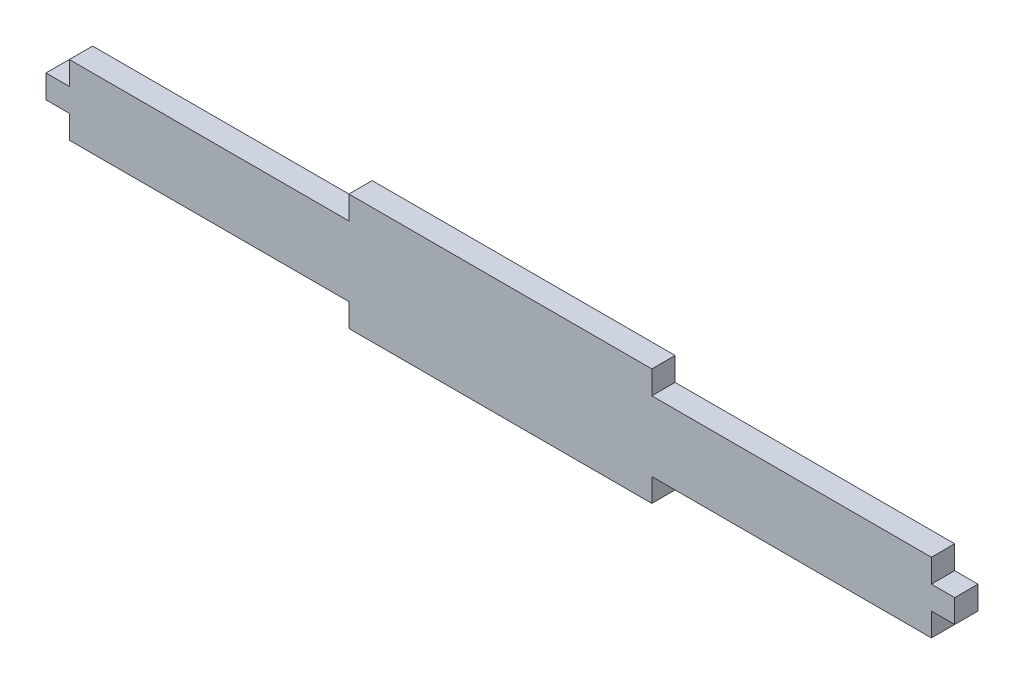
ISO-10303-21;
HEADER;
FILE_DESCRIPTION(('STEP AP214'),'2;1');
FILE_NAME('part.step','',(''),(''),'','','');
FILE_SCHEMA(('AUTOMOTIVE_DESIGN { 1 0 10303 214 1 1 1 1 }'));
ENDSEC;
DATA;
#1=APPLICATION_CONTEXT('core data for automotive mechanical design processes');
#2=APPLICATION_PROTOCOL_DEFINITION('international standard','automotive_design',2000,#1);
#3=PRODUCT_CONTEXT('',#1,'mechanical');
#4=PRODUCT('Part','Part','',(#3));
#5=PRODUCT_RELATED_PRODUCT_CATEGORY('part','',(#4));
#6=PRODUCT_DEFINITION_FORMATION('','',#4);
#7=PRODUCT_DEFINITION_CONTEXT('part definition',#1,'design');
#8=PRODUCT_DEFINITION('design','',#6,#7);
#9=PRODUCT_DEFINITION_SHAPE('','',#8);
#10=(LENGTH_UNIT() NAMED_UNIT(*) SI_UNIT(.MILLI.,.METRE.));
#11=(NAMED_UNIT(*) PLANE_ANGLE_UNIT() SI_UNIT($,.RADIAN.));
#12=(NAMED_UNIT(*) SI_UNIT($,.STERADIAN.) SOLID_ANGLE_UNIT());
#13=UNCERTAINTY_MEASURE_WITH_UNIT(LENGTH_MEASURE(1.E-05),#10,'distance_accuracy_value','');
#14=(GEOMETRIC_REPRESENTATION_CONTEXT(3) GLOBAL_UNCERTAINTY_ASSIGNED_CONTEXT((#13)) GLOBAL_UNIT_ASSIGNED_CONTEXT((#10,
#11,#12)) REPRESENTATION_CONTEXT('',''));
#15=CARTESIAN_POINT('',(0.,0.,0.));
#16=DIRECTION('',(0.,0.,1.));
#17=DIRECTION('',(1.,0.,0.));
#18=AXIS2_PLACEMENT_3D('',#15,#16,#17);
#19=CARTESIAN_POINT('',(-19.5,-7.5,3.));
#20=DIRECTION('',(1.,0.,0.));
#21=DIRECTION('',(0.,1.,0.));
#22=AXIS2_PLACEMENT_3D('',#19,#20,#21);
#23=PLANE('',#22);
#24=DIRECTION('',(0.,-1.,0.));
#25=VECTOR('',#24,1.);
#26=CARTESIAN_POINT('',(-19.5,-7.5,0.));
#27=LINE('',#26,#25);
#28=CARTESIAN_POINT('',(-19.5,-4.5,0.));
#29=VERTEX_POINT('',#28);
#30=CARTESIAN_POINT('',(-19.5,-7.5,0.));
#31=VERTEX_POINT('',#30);
#32=EDGE_CURVE('E201',#29,#31,#27,.T.);
#33=ORIENTED_EDGE('',*,*,#32,.T.);
#34=DIRECTION('',(0.,0.,-1.));
#35=VECTOR('',#34,1.);
#36=CARTESIAN_POINT('',(-19.5,-7.5,3.));
#37=LINE('',#36,#35);
#38=CARTESIAN_POINT('',(-19.5,-7.5,3.));
#39=VERTEX_POINT('',#38);
#40=EDGE_CURVE('E11',#39,#31,#37,.T.);
#41=ORIENTED_EDGE('',*,*,#40,.F.);
#42=DIRECTION('',(0.,-1.,0.));
#43=VECTOR('',#42,1.);
#44=CARTESIAN_POINT('',(-19.5,-7.5,3.));
#45=LINE('',#44,#43);
#46=CARTESIAN_POINT('',(-19.5,-4.5,3.));
#47=VERTEX_POINT('',#46);
#48=EDGE_CURVE('E239',#47,#39,#45,.T.);
#49=ORIENTED_EDGE('',*,*,#48,.F.);
#50=DIRECTION('',(0.,0.,-1.));
#51=VECTOR('',#50,1.);
#52=CARTESIAN_POINT('',(-19.5,-4.5,3.));
#53=LINE('',#52,#51);
#54=EDGE_CURVE('E197',#47,#29,#53,.T.);
#55=ORIENTED_EDGE('',*,*,#54,.T.);
#56=EDGE_LOOP('',(#33,#41,#49,#55));
#57=FACE_BOUND('',#56,.T.);
#58=ADVANCED_FACE('F33',(#57),#23,.F.);
#59=CARTESIAN_POINT('',(-19.5,-7.5,3.));
#60=DIRECTION('',(0.,1.,0.));
#61=DIRECTION('',(0.,0.,1.));
#62=AXIS2_PLACEMENT_3D('',#59,#60,#61);
#63=PLANE('',#62);
#64=DIRECTION('',(1.,0.,0.));
#65=VECTOR('',#64,1.);
#66=CARTESIAN_POINT('',(-19.5,-7.5,0.));
#67=LINE('',#66,#65);
#68=CARTESIAN_POINT('',(19.5,-7.5,0.));
#69=VERTEX_POINT('',#68);
#70=EDGE_CURVE('E204',#31,#69,#67,.T.);
#71=ORIENTED_EDGE('',*,*,#70,.T.);
#72=DIRECTION('',(0.,0.,-1.));
#73=VECTOR('',#72,1.);
#74=CARTESIAN_POINT('',(19.5,-7.5,3.));
#75=LINE('',#74,#73);
#76=CARTESIAN_POINT('',(19.5,-7.5,3.));
#77=VERTEX_POINT('',#76);
#78=EDGE_CURVE('E41',#77,#69,#75,.T.);
#79=ORIENTED_EDGE('',*,*,#78,.F.);
#80=DIRECTION('',(1.,0.,0.));
#81=VECTOR('',#80,1.);
#82=CARTESIAN_POINT('',(-19.5,-7.5,3.));
#83=LINE('',#82,#81);
#84=EDGE_CURVE('E128',#39,#77,#83,.T.);
#85=ORIENTED_EDGE('',*,*,#84,.F.);
#86=ORIENTED_EDGE('',*,*,#40,.T.);
#87=EDGE_LOOP('',(#71,#79,#85,#86));
#88=FACE_BOUND('',#87,.T.);
#89=ADVANCED_FACE('F357',(#88),#63,.F.);
#90=CARTESIAN_POINT('',(19.5,-4.5,3.));
#91=DIRECTION('',(-1.,0.,0.));
#92=DIRECTION('',(0.,-1.,0.));
#93=AXIS2_PLACEMENT_3D('',#90,#91,#92);
#94=PLANE('',#93);
#95=DIRECTION('',(0.,1.,0.));
#96=VECTOR('',#95,1.);
#97=CARTESIAN_POINT('',(19.5,-4.5,0.));
#98=LINE('',#97,#96);
#99=CARTESIAN_POINT('',(19.5,-4.5,0.));
#100=VERTEX_POINT('',#99);
#101=EDGE_CURVE('E206',#69,#100,#98,.T.);
#102=ORIENTED_EDGE('',*,*,#101,.T.);
#103=DIRECTION('',(0.,0.,-1.));
#104=VECTOR('',#103,1.);
#105=CARTESIAN_POINT('',(19.5,-4.5,3.));
#106=LINE('',#105,#104);
#107=CARTESIAN_POINT('',(19.5,-4.5,3.));
#108=VERTEX_POINT('',#107);
#109=EDGE_CURVE('E282',#108,#100,#106,.T.);
#110=ORIENTED_EDGE('',*,*,#109,.F.);
#111=DIRECTION('',(0.,1.,0.));
#112=VECTOR('',#111,1.);
#113=CARTESIAN_POINT('',(19.5,-4.5,3.));
#114=LINE('',#113,#112);
#115=EDGE_CURVE('E290',#77,#108,#114,.T.);
#116=ORIENTED_EDGE('',*,*,#115,.F.);
#117=ORIENTED_EDGE('',*,*,#78,.T.);
#118=EDGE_LOOP('',(#102,#110,#116,#117));
#119=FACE_BOUND('',#118,.T.);
#120=ADVANCED_FACE('F288',(#119),#94,.F.);
#121=CARTESIAN_POINT('',(55.5,-4.5,3.));
#122=DIRECTION('',(0.,1.,0.));
#123=DIRECTION('',(0.,0.,1.));
#124=AXIS2_PLACEMENT_3D('',#121,#122,#123);
#125=PLANE('',#124);
#126=DIRECTION('',(1.,0.,0.));
#127=VECTOR('',#126,1.);
#128=CARTESIAN_POINT('',(55.5,-4.5,0.));
#129=LINE('',#128,#127);
#130=CARTESIAN_POINT('',(55.5,-4.5,0.));
#131=VERTEX_POINT('',#130);
#132=EDGE_CURVE('E208',#100,#131,#129,.T.);
#133=ORIENTED_EDGE('',*,*,#132,.T.);
#134=DIRECTION('',(0.,0.,-1.));
#135=VECTOR('',#134,1.);
#136=CARTESIAN_POINT('',(55.5,-4.5,3.));
#137=LINE('',#136,#135);
#138=CARTESIAN_POINT('',(55.5,-4.5,3.));
#139=VERTEX_POINT('',#138);
#140=EDGE_CURVE('E279',#139,#131,#137,.T.);
#141=ORIENTED_EDGE('',*,*,#140,.F.);
#142=DIRECTION('',(1.,0.,0.));
#143=VECTOR('',#142,1.);
#144=CARTESIAN_POINT('',(55.5,-4.5,3.));
#145=LINE('',#144,#143);
#146=EDGE_CURVE('E308',#108,#139,#145,.T.);
#147=ORIENTED_EDGE('',*,*,#146,.F.);
#148=ORIENTED_EDGE('',*,*,#109,.T.);
#149=EDGE_LOOP('',(#133,#141,#147,#148));
#150=FACE_BOUND('',#149,.T.);
#151=ADVANCED_FACE('F299',(#150),#125,.F.);
#152=CARTESIAN_POINT('',(55.5,-1.5,3.));
#153=DIRECTION('',(-1.,0.,0.));
#154=DIRECTION('',(0.,0.,1.));
#155=AXIS2_PLACEMENT_3D('',#152,#153,#154);
#156=PLANE('',#155);
#157=DIRECTION('',(0.,1.,0.));
#158=VECTOR('',#157,1.);
#159=CARTESIAN_POINT('',(55.5,-1.5,0.));
#160=LINE('',#159,#158);
#161=CARTESIAN_POINT('',(55.5,-1.5,0.));
#162=VERTEX_POINT('',#161);
#163=EDGE_CURVE('E210',#131,#162,#160,.T.);
#164=ORIENTED_EDGE('',*,*,#163,.T.);
#165=DIRECTION('',(0.,0.,-1.));
#166=VECTOR('',#165,1.);
#167=CARTESIAN_POINT('',(55.5,-1.5,3.));
#168=LINE('',#167,#166);
#169=CARTESIAN_POINT('',(55.5,-1.5,3.));
#170=VERTEX_POINT('',#169);
#171=EDGE_CURVE('E276',#170,#162,#168,.T.);
#172=ORIENTED_EDGE('',*,*,#171,.F.);
#173=DIRECTION('',(0.,1.,0.));
#174=VECTOR('',#173,1.);
#175=CARTESIAN_POINT('',(55.5,-1.5,3.));
#176=LINE('',#175,#174);
#177=EDGE_CURVE('E305',#139,#170,#176,.T.);
#178=ORIENTED_EDGE('',*,*,#177,.F.);
#179=ORIENTED_EDGE('',*,*,#140,.T.);
#180=EDGE_LOOP('',(#164,#172,#178,#179));
#181=FACE_BOUND('',#180,.T.);
#182=ADVANCED_FACE('F303',(#181),#156,.F.);
#183=CARTESIAN_POINT('',(58.5,-1.50000000000002,3.));
#184=DIRECTION('',(0.,1.,0.));
#185=DIRECTION('',(-1.,0.,0.));
#186=AXIS2_PLACEMENT_3D('',#183,#184,#185);
#187=PLANE('',#186);
#188=DIRECTION('',(1.,0.,0.));
#189=VECTOR('',#188,1.);
#190=CARTESIAN_POINT('',(58.5,-1.50000000000002,0.));
#191=LINE('',#190,#189);
#192=CARTESIAN_POINT('',(58.5,-1.50000000000002,0.));
#193=VERTEX_POINT('',#192);
#194=EDGE_CURVE('E212',#162,#193,#191,.T.);
#195=ORIENTED_EDGE('',*,*,#194,.T.);
#196=DIRECTION('',(0.,0.,-1.));
#197=VECTOR('',#196,1.);
#198=CARTESIAN_POINT('',(58.5,-1.50000000000002,3.));
#199=LINE('',#198,#197);
#200=CARTESIAN_POINT('',(58.5,-1.50000000000002,3.));
#201=VERTEX_POINT('',#200);
#202=EDGE_CURVE('E273',#201,#193,#199,.T.);
#203=ORIENTED_EDGE('',*,*,#202,.F.);
#204=DIRECTION('',(1.,0.,0.));
#205=VECTOR('',#204,1.);
#206=CARTESIAN_POINT('',(58.5,-1.50000000000002,3.));
#207=LINE('',#206,#205);
#208=EDGE_CURVE('E307',#170,#201,#207,.T.);
#209=ORIENTED_EDGE('',*,*,#208,.F.);
#210=ORIENTED_EDGE('',*,*,#171,.T.);
#211=EDGE_LOOP('',(#195,#203,#209,#210));
#212=FACE_BOUND('',#211,.T.);
#213=ADVANCED_FACE('F370',(#212),#187,.F.);
#214=CARTESIAN_POINT('',(58.5,-1.50000000000002,3.));
#215=DIRECTION('',(-1.,0.,0.));
#216=DIRECTION('',(0.,-1.,0.));
#217=AXIS2_PLACEMENT_3D('',#214,#215,#216);
#218=PLANE('',#217);
#219=DIRECTION('',(0.,1.,0.));
#220=VECTOR('',#219,1.);
#221=CARTESIAN_POINT('',(58.5,-1.50000000000002,0.));
#222=LINE('',#221,#220);
#223=CARTESIAN_POINT('',(58.5,1.49999999999998,0.));
#224=VERTEX_POINT('',#223);
#225=EDGE_CURVE('E214',#193,#224,#222,.T.);
#226=ORIENTED_EDGE('',*,*,#225,.T.);
#227=DIRECTION('',(0.,0.,-1.));
#228=VECTOR('',#227,1.);
#229=CARTESIAN_POINT('',(58.5,1.49999999999998,3.));
#230=LINE('',#229,#228);
#231=CARTESIAN_POINT('',(58.5,1.49999999999998,3.));
#232=VERTEX_POINT('',#231);
#233=EDGE_CURVE('E270',#232,#224,#230,.T.);
#234=ORIENTED_EDGE('',*,*,#233,.F.);
#235=DIRECTION('',(0.,1.,0.));
#236=VECTOR('',#235,1.);
#237=CARTESIAN_POINT('',(58.5,-1.50000000000002,3.));
#238=LINE('',#237,#236);
#239=EDGE_CURVE('E310',#201,#232,#238,.T.);
#240=ORIENTED_EDGE('',*,*,#239,.F.);
#241=ORIENTED_EDGE('',*,*,#202,.T.);
#242=EDGE_LOOP('',(#226,#234,#240,#241));
#243=FACE_BOUND('',#242,.T.);
#244=ADVANCED_FACE('F373',(#243),#218,.F.);
#245=CARTESIAN_POINT('',(58.5,1.49999999999998,3.));
#246=DIRECTION('',(0.,-1.,0.));
#247=DIRECTION('',(1.,0.,0.));
#248=AXIS2_PLACEMENT_3D('',#245,#246,#247);
#249=PLANE('',#248);
#250=DIRECTION('',(-1.,0.,0.));
#251=VECTOR('',#250,1.);
#252=CARTESIAN_POINT('',(58.5,1.49999999999998,0.));
#253=LINE('',#252,#251);
#254=CARTESIAN_POINT('',(55.5,1.5,0.));
#255=VERTEX_POINT('',#254);
#256=EDGE_CURVE('E216',#224,#255,#253,.T.);
#257=ORIENTED_EDGE('',*,*,#256,.T.);
#258=DIRECTION('',(0.,0.,-1.));
#259=VECTOR('',#258,1.);
#260=CARTESIAN_POINT('',(55.5,1.5,3.));
#261=LINE('',#260,#259);
#262=CARTESIAN_POINT('',(55.5,1.5,3.));
#263=VERTEX_POINT('',#262);
#264=EDGE_CURVE('E267',#263,#255,#261,.T.);
#265=ORIENTED_EDGE('',*,*,#264,.F.);
#266=DIRECTION('',(-1.,0.,0.));
#267=VECTOR('',#266,1.);
#268=CARTESIAN_POINT('',(58.5,1.49999999999998,3.));
#269=LINE('',#268,#267);
#270=EDGE_CURVE('E316',#232,#263,#269,.T.);
#271=ORIENTED_EDGE('',*,*,#270,.F.);
#272=ORIENTED_EDGE('',*,*,#233,.T.);
#273=EDGE_LOOP('',(#257,#265,#271,#272));
#274=FACE_BOUND('',#273,.T.);
#275=ADVANCED_FACE('F377',(#274),#249,.F.);
#276=CARTESIAN_POINT('',(55.5,1.5,3.));
#277=DIRECTION('',(-1.,0.,0.));
#278=DIRECTION('',(0.,0.,1.));
#279=AXIS2_PLACEMENT_3D('',#276,#277,#278);
#280=PLANE('',#279);
#281=DIRECTION('',(0.,1.,0.));
#282=VECTOR('',#281,1.);
#283=CARTESIAN_POINT('',(55.5,1.5,0.));
#284=LINE('',#283,#282);
#285=CARTESIAN_POINT('',(55.5,4.5,0.));
#286=VERTEX_POINT('',#285);
#287=EDGE_CURVE('E218',#255,#286,#284,.T.);
#288=ORIENTED_EDGE('',*,*,#287,.T.);
#289=DIRECTION('',(0.,0.,-1.));
#290=VECTOR('',#289,1.);
#291=CARTESIAN_POINT('',(55.5,4.5,3.));
#292=LINE('',#291,#290);
#293=CARTESIAN_POINT('',(55.5,4.5,3.));
#294=VERTEX_POINT('',#293);
#295=EDGE_CURVE('E264',#294,#286,#292,.T.);
#296=ORIENTED_EDGE('',*,*,#295,.F.);
#297=DIRECTION('',(0.,1.,0.));
#298=VECTOR('',#297,1.);
#299=CARTESIAN_POINT('',(55.5,1.5,3.));
#300=LINE('',#299,#298);
#301=EDGE_CURVE('E318',#263,#294,#300,.T.);
#302=ORIENTED_EDGE('',*,*,#301,.F.);
#303=ORIENTED_EDGE('',*,*,#264,.T.);
#304=EDGE_LOOP('',(#288,#296,#302,#303));
#305=FACE_BOUND('',#304,.T.);
#306=ADVANCED_FACE('F381',(#305),#280,.F.);
#307=CARTESIAN_POINT('',(19.5,4.5,3.));
#308=DIRECTION('',(0.,-1.,0.));
#309=DIRECTION('',(0.,0.,-1.));
#310=AXIS2_PLACEMENT_3D('',#307,#308,#309);
#311=PLANE('',#310);
#312=DIRECTION('',(-1.,0.,0.));
#313=VECTOR('',#312,1.);
#314=CARTESIAN_POINT('',(19.5,4.5,0.));
#315=LINE('',#314,#313);
#316=CARTESIAN_POINT('',(19.5,4.5,0.));
#317=VERTEX_POINT('',#316);
#318=EDGE_CURVE('E220',#286,#317,#315,.T.);
#319=ORIENTED_EDGE('',*,*,#318,.T.);
#320=DIRECTION('',(0.,0.,-1.));
#321=VECTOR('',#320,1.);
#322=CARTESIAN_POINT('',(19.5,4.5,3.));
#323=LINE('',#322,#321);
#324=CARTESIAN_POINT('',(19.5,4.5,3.));
#325=VERTEX_POINT('',#324);
#326=EDGE_CURVE('E261',#325,#317,#323,.T.);
#327=ORIENTED_EDGE('',*,*,#326,.F.);
#328=DIRECTION('',(-1.,0.,0.));
#329=VECTOR('',#328,1.);
#330=CARTESIAN_POINT('',(19.5,4.5,3.));
#331=LINE('',#330,#329);
#332=EDGE_CURVE('E320',#294,#325,#331,.T.);
#333=ORIENTED_EDGE('',*,*,#332,.F.);
#334=ORIENTED_EDGE('',*,*,#295,.T.);
#335=EDGE_LOOP('',(#319,#327,#333,#334));
#336=FACE_BOUND('',#335,.T.);
#337=ADVANCED_FACE('F385',(#336),#311,.F.);
#338=CARTESIAN_POINT('',(19.5,7.5,3.));
#339=DIRECTION('',(-1.,0.,0.));
#340=DIRECTION('',(0.,-1.,0.));
#341=AXIS2_PLACEMENT_3D('',#338,#339,#340);
#342=PLANE('',#341);
#343=DIRECTION('',(0.,1.,0.));
#344=VECTOR('',#343,1.);
#345=CARTESIAN_POINT('',(19.5,7.5,0.));
#346=LINE('',#345,#344);
#347=CARTESIAN_POINT('',(19.5,7.5,0.));
#348=VERTEX_POINT('',#347);
#349=EDGE_CURVE('E222',#317,#348,#346,.T.);
#350=ORIENTED_EDGE('',*,*,#349,.T.);
#351=DIRECTION('',(0.,0.,-1.));
#352=VECTOR('',#351,1.);
#353=CARTESIAN_POINT('',(19.5,7.5,3.));
#354=LINE('',#353,#352);
#355=CARTESIAN_POINT('',(19.5,7.5,3.));
#356=VERTEX_POINT('',#355);
#357=EDGE_CURVE('E258',#356,#348,#354,.T.);
#358=ORIENTED_EDGE('',*,*,#357,.F.);
#359=DIRECTION('',(0.,1.,0.));
#360=VECTOR('',#359,1.);
#361=CARTESIAN_POINT('',(19.5,7.5,3.));
#362=LINE('',#361,#360);
#363=EDGE_CURVE('E322',#325,#356,#362,.T.);
#364=ORIENTED_EDGE('',*,*,#363,.F.);
#365=ORIENTED_EDGE('',*,*,#326,.T.);
#366=EDGE_LOOP('',(#350,#358,#364,#365));
#367=FACE_BOUND('',#366,.T.);
#368=ADVANCED_FACE('F389',(#367),#342,.F.);
#369=CARTESIAN_POINT('',(19.5,7.5,3.));
#370=DIRECTION('',(0.,-1.,0.));
#371=DIRECTION('',(0.,0.,-1.));
#372=AXIS2_PLACEMENT_3D('',#369,#370,#371);
#373=PLANE('',#372);
#374=DIRECTION('',(-1.,0.,0.));
#375=VECTOR('',#374,1.);
#376=CARTESIAN_POINT('',(19.5,7.5,0.));
#377=LINE('',#376,#375);
#378=CARTESIAN_POINT('',(-19.5,7.5,0.));
#379=VERTEX_POINT('',#378);
#380=EDGE_CURVE('E224',#348,#379,#377,.T.);
#381=ORIENTED_EDGE('',*,*,#380,.T.);
#382=DIRECTION('',(0.,0.,-1.));
#383=VECTOR('',#382,1.);
#384=CARTESIAN_POINT('',(-19.5,7.5,3.));
#385=LINE('',#384,#383);
#386=CARTESIAN_POINT('',(-19.5,7.5,3.));
#387=VERTEX_POINT('',#386);
#388=EDGE_CURVE('E255',#387,#379,#385,.T.);
#389=ORIENTED_EDGE('',*,*,#388,.F.);
#390=DIRECTION('',(-1.,0.,0.));
#391=VECTOR('',#390,1.);
#392=CARTESIAN_POINT('',(19.5,7.5,3.));
#393=LINE('',#392,#391);
#394=EDGE_CURVE('E324',#356,#387,#393,.T.);
#395=ORIENTED_EDGE('',*,*,#394,.F.);
#396=ORIENTED_EDGE('',*,*,#357,.T.);
#397=EDGE_LOOP('',(#381,#389,#395,#396));
#398=FACE_BOUND('',#397,.T.);
#399=ADVANCED_FACE('F393',(#398),#373,.F.);
#400=CARTESIAN_POINT('',(-19.5,7.5,3.));
#401=DIRECTION('',(1.,0.,0.));
#402=DIRECTION('',(0.,0.,-1.));
#403=AXIS2_PLACEMENT_3D('',#400,#401,#402);
#404=PLANE('',#403);
#405=DIRECTION('',(0.,-1.,0.));
#406=VECTOR('',#405,1.);
#407=CARTESIAN_POINT('',(-19.5,7.5,0.));
#408=LINE('',#407,#406);
#409=CARTESIAN_POINT('',(-19.5,4.5,0.));
#410=VERTEX_POINT('',#409);
#411=EDGE_CURVE('E226',#379,#410,#408,.T.);
#412=ORIENTED_EDGE('',*,*,#411,.T.);
#413=DIRECTION('',(0.,0.,-1.));
#414=VECTOR('',#413,1.);
#415=CARTESIAN_POINT('',(-19.5,4.5,3.));
#416=LINE('',#415,#414);
#417=CARTESIAN_POINT('',(-19.5,4.5,3.));
#418=VERTEX_POINT('',#417);
#419=EDGE_CURVE('E252',#418,#410,#416,.T.);
#420=ORIENTED_EDGE('',*,*,#419,.F.);
#421=DIRECTION('',(0.,-1.,0.));
#422=VECTOR('',#421,1.);
#423=CARTESIAN_POINT('',(-19.5,7.5,3.));
#424=LINE('',#423,#422);
#425=EDGE_CURVE('E326',#387,#418,#424,.T.);
#426=ORIENTED_EDGE('',*,*,#425,.F.);
#427=ORIENTED_EDGE('',*,*,#388,.T.);
#428=EDGE_LOOP('',(#412,#420,#426,#427));
#429=FACE_BOUND('',#428,.T.);
#430=ADVANCED_FACE('F397',(#429),#404,.F.);
#431=CARTESIAN_POINT('',(-55.5,4.5,3.));
#432=DIRECTION('',(0.,-1.,0.));
#433=DIRECTION('',(0.,0.,-1.));
#434=AXIS2_PLACEMENT_3D('',#431,#432,#433);
#435=PLANE('',#434);
#436=DIRECTION('',(-1.,0.,0.));
#437=VECTOR('',#436,1.);
#438=CARTESIAN_POINT('',(-55.5,4.5,0.));
#439=LINE('',#438,#437);
#440=CARTESIAN_POINT('',(-55.5,4.5,0.));
#441=VERTEX_POINT('',#440);
#442=EDGE_CURVE('E228',#410,#441,#439,.T.);
#443=ORIENTED_EDGE('',*,*,#442,.T.);
#444=DIRECTION('',(0.,0.,-1.));
#445=VECTOR('',#444,1.);
#446=CARTESIAN_POINT('',(-55.5,4.5,3.));
#447=LINE('',#446,#445);
#448=CARTESIAN_POINT('',(-55.5,4.5,3.));
#449=VERTEX_POINT('',#448);
#450=EDGE_CURVE('E249',#449,#441,#447,.T.);
#451=ORIENTED_EDGE('',*,*,#450,.F.);
#452=DIRECTION('',(-1.,0.,0.));
#453=VECTOR('',#452,1.);
#454=CARTESIAN_POINT('',(-55.5,4.5,3.));
#455=LINE('',#454,#453);
#456=EDGE_CURVE('E328',#418,#449,#455,.T.);
#457=ORIENTED_EDGE('',*,*,#456,.F.);
#458=ORIENTED_EDGE('',*,*,#419,.T.);
#459=EDGE_LOOP('',(#443,#451,#457,#458));
#460=FACE_BOUND('',#459,.T.);
#461=ADVANCED_FACE('F401',(#460),#435,.F.);
#462=CARTESIAN_POINT('',(-55.5,1.49999999999998,3.));
#463=DIRECTION('',(1.,0.,0.));
#464=DIRECTION('',(0.,0.,-1.));
#465=AXIS2_PLACEMENT_3D('',#462,#463,#464);
#466=PLANE('',#465);
#467=DIRECTION('',(0.,-1.,0.));
#468=VECTOR('',#467,1.);
#469=CARTESIAN_POINT('',(-55.5,1.49999999999998,0.));
#470=LINE('',#469,#468);
#471=CARTESIAN_POINT('',(-55.5,1.49999999999998,0.));
#472=VERTEX_POINT('',#471);
#473=EDGE_CURVE('E230',#441,#472,#470,.T.);
#474=ORIENTED_EDGE('',*,*,#473,.T.);
#475=DIRECTION('',(0.,0.,-1.));
#476=VECTOR('',#475,1.);
#477=CARTESIAN_POINT('',(-55.5,1.49999999999998,3.));
#478=LINE('',#477,#476);
#479=CARTESIAN_POINT('',(-55.5,1.49999999999998,3.));
#480=VERTEX_POINT('',#479);
#481=EDGE_CURVE('E246',#480,#472,#478,.T.);
#482=ORIENTED_EDGE('',*,*,#481,.F.);
#483=DIRECTION('',(0.,-1.,0.));
#484=VECTOR('',#483,1.);
#485=CARTESIAN_POINT('',(-55.5,1.49999999999998,3.));
#486=LINE('',#485,#484);
#487=EDGE_CURVE('E330',#449,#480,#486,.T.);
#488=ORIENTED_EDGE('',*,*,#487,.F.);
#489=ORIENTED_EDGE('',*,*,#450,.T.);
#490=EDGE_LOOP('',(#474,#482,#488,#489));
#491=FACE_BOUND('',#490,.T.);
#492=ADVANCED_FACE('F405',(#491),#466,.F.);
#493=CARTESIAN_POINT('',(-58.5,1.49999999999999,3.));
#494=DIRECTION('',(0.,-1.,0.));
#495=DIRECTION('',(1.,0.,0.));
#496=AXIS2_PLACEMENT_3D('',#493,#494,#495);
#497=PLANE('',#496);
#498=DIRECTION('',(-1.,0.,0.));
#499=VECTOR('',#498,1.);
#500=CARTESIAN_POINT('',(-58.5,1.49999999999999,0.));
#501=LINE('',#500,#499);
#502=CARTESIAN_POINT('',(-58.5,1.49999999999999,0.));
#503=VERTEX_POINT('',#502);
#504=EDGE_CURVE('E232',#472,#503,#501,.T.);
#505=ORIENTED_EDGE('',*,*,#504,.T.);
#506=DIRECTION('',(0.,0.,-1.));
#507=VECTOR('',#506,1.);
#508=CARTESIAN_POINT('',(-58.5,1.49999999999999,3.));
#509=LINE('',#508,#507);
#510=CARTESIAN_POINT('',(-58.5,1.49999999999999,3.));
#511=VERTEX_POINT('',#510);
#512=EDGE_CURVE('E243',#511,#503,#509,.T.);
#513=ORIENTED_EDGE('',*,*,#512,.F.);
#514=DIRECTION('',(-1.,0.,0.));
#515=VECTOR('',#514,1.);
#516=CARTESIAN_POINT('',(-58.5,1.49999999999999,3.));
#517=LINE('',#516,#515);
#518=EDGE_CURVE('E332',#480,#511,#517,.T.);
#519=ORIENTED_EDGE('',*,*,#518,.F.);
#520=ORIENTED_EDGE('',*,*,#481,.T.);
#521=EDGE_LOOP('',(#505,#513,#519,#520));
#522=FACE_BOUND('',#521,.T.);
#523=ADVANCED_FACE('F338',(#522),#497,.F.);
#524=CARTESIAN_POINT('',(-58.5,1.49999999999999,3.));
#525=DIRECTION('',(1.,0.,0.));
#526=DIRECTION('',(0.,0.,-1.));
#527=AXIS2_PLACEMENT_3D('',#524,#525,#526);
#528=PLANE('',#527);
#529=DIRECTION('',(0.,-1.,0.));
#530=VECTOR('',#529,1.);
#531=CARTESIAN_POINT('',(-58.5,1.49999999999999,0.));
#532=LINE('',#531,#530);
#533=CARTESIAN_POINT('',(-58.5,-1.5,0.));
#534=VERTEX_POINT('',#533);
#535=EDGE_CURVE('E234',#503,#534,#532,.T.);
#536=ORIENTED_EDGE('',*,*,#535,.T.);
#537=DIRECTION('',(0.,0.,-1.));
#538=VECTOR('',#537,1.);
#539=CARTESIAN_POINT('',(-58.5,-1.5,3.));
#540=LINE('',#539,#538);
#541=CARTESIAN_POINT('',(-58.5,-1.5,3.));
#542=VERTEX_POINT('',#541);
#543=EDGE_CURVE('E192',#542,#534,#540,.T.);
#544=ORIENTED_EDGE('',*,*,#543,.F.);
#545=DIRECTION('',(0.,-1.,0.));
#546=VECTOR('',#545,1.);
#547=CARTESIAN_POINT('',(-58.5,1.49999999999999,3.));
#548=LINE('',#547,#546);
#549=EDGE_CURVE('E183',#511,#542,#548,.T.);
#550=ORIENTED_EDGE('',*,*,#549,.F.);
#551=ORIENTED_EDGE('',*,*,#512,.T.);
#552=EDGE_LOOP('',(#536,#544,#550,#551));
#553=FACE_BOUND('',#552,.T.);
#554=ADVANCED_FACE('F342',(#553),#528,.F.);
#555=CARTESIAN_POINT('',(-58.5,-1.5,3.));
#556=DIRECTION('',(0.,1.,0.));
#557=DIRECTION('',(-1.,0.,0.));
#558=AXIS2_PLACEMENT_3D('',#555,#556,#557);
#559=PLANE('',#558);
#560=DIRECTION('',(1.,0.,0.));
#561=VECTOR('',#560,1.);
#562=CARTESIAN_POINT('',(-58.5,-1.5,0.));
#563=LINE('',#562,#561);
#564=CARTESIAN_POINT('',(-55.5,-1.50000000000002,0.));
#565=VERTEX_POINT('',#564);
#566=EDGE_CURVE('E191',#534,#565,#563,.T.);
#567=ORIENTED_EDGE('',*,*,#566,.T.);
#568=DIRECTION('',(0.,0.,-1.));
#569=VECTOR('',#568,1.);
#570=CARTESIAN_POINT('',(-55.5,-1.50000000000002,3.));
#571=LINE('',#570,#569);
#572=CARTESIAN_POINT('',(-55.5,-1.50000000000002,3.));
#573=VERTEX_POINT('',#572);
#574=EDGE_CURVE('E188',#573,#565,#571,.T.);
#575=ORIENTED_EDGE('',*,*,#574,.F.);
#576=DIRECTION('',(1.,0.,0.));
#577=VECTOR('',#576,1.);
#578=CARTESIAN_POINT('',(-58.5,-1.5,3.));
#579=LINE('',#578,#577);
#580=EDGE_CURVE('E177',#542,#573,#579,.T.);
#581=ORIENTED_EDGE('',*,*,#580,.F.);
#582=ORIENTED_EDGE('',*,*,#543,.T.);
#583=EDGE_LOOP('',(#567,#575,#581,#582));
#584=FACE_BOUND('',#583,.T.);
#585=ADVANCED_FACE('F189',(#584),#559,.F.);
#586=CARTESIAN_POINT('',(-55.5,-1.50000000000002,3.));
#587=DIRECTION('',(1.,0.,0.));
#588=DIRECTION('',(0.,1.,0.));
#589=AXIS2_PLACEMENT_3D('',#586,#587,#588);
#590=PLANE('',#589);
#591=DIRECTION('',(0.,-1.,0.));
#592=VECTOR('',#591,1.);
#593=CARTESIAN_POINT('',(-55.5,-1.50000000000002,0.));
#594=LINE('',#593,#592);
#595=CARTESIAN_POINT('',(-55.5,-4.5,0.));
#596=VERTEX_POINT('',#595);
#597=EDGE_CURVE('E114',#565,#596,#594,.T.);
#598=ORIENTED_EDGE('',*,*,#597,.T.);
#599=DIRECTION('',(0.,0.,-1.));
#600=VECTOR('',#599,1.);
#601=CARTESIAN_POINT('',(-55.5,-4.5,3.));
#602=LINE('',#601,#600);
#603=CARTESIAN_POINT('',(-55.5,-4.5,3.));
#604=VERTEX_POINT('',#603);
#605=EDGE_CURVE('E193',#604,#596,#602,.T.);
#606=ORIENTED_EDGE('',*,*,#605,.F.);
#607=DIRECTION('',(0.,-1.,0.));
#608=VECTOR('',#607,1.);
#609=CARTESIAN_POINT('',(-55.5,-1.50000000000002,3.));
#610=LINE('',#609,#608);
#611=EDGE_CURVE('E181',#573,#604,#610,.T.);
#612=ORIENTED_EDGE('',*,*,#611,.F.);
#613=ORIENTED_EDGE('',*,*,#574,.T.);
#614=EDGE_LOOP('',(#598,#606,#612,#613));
#615=FACE_BOUND('',#614,.T.);
#616=ADVANCED_FACE('F195',(#615),#590,.F.);
#617=CARTESIAN_POINT('',(-19.5,-4.5,3.));
#618=DIRECTION('',(0.,1.,0.));
#619=DIRECTION('',(0.,0.,1.));
#620=AXIS2_PLACEMENT_3D('',#617,#618,#619);
#621=PLANE('',#620);
#622=DIRECTION('',(1.,0.,0.));
#623=VECTOR('',#622,1.);
#624=CARTESIAN_POINT('',(-19.5,-4.5,0.));
#625=LINE('',#624,#623);
#626=EDGE_CURVE('E120',#596,#29,#625,.T.);
#627=ORIENTED_EDGE('',*,*,#626,.T.);
#628=ORIENTED_EDGE('',*,*,#54,.F.);
#629=DIRECTION('',(1.,0.,0.));
#630=VECTOR('',#629,1.);
#631=CARTESIAN_POINT('',(-19.5,-4.5,3.));
#632=LINE('',#631,#630);
#633=EDGE_CURVE('E49',#604,#47,#632,.T.);
#634=ORIENTED_EDGE('',*,*,#633,.F.);
#635=ORIENTED_EDGE('',*,*,#605,.T.);
#636=EDGE_LOOP('',(#627,#628,#634,#635));
#637=FACE_BOUND('',#636,.T.);
#638=ADVANCED_FACE('F346',(#637),#621,.F.);
#639=CARTESIAN_POINT('',(0.,0.,3.));
#640=DIRECTION('',(0.,0.,1.));
#641=DIRECTION('',(1.,0.,0.));
#642=AXIS2_PLACEMENT_3D('',#639,#640,#641);
#643=PLANE('',#642);
#644=ORIENTED_EDGE('',*,*,#48,.T.);
#645=ORIENTED_EDGE('',*,*,#84,.T.);
#646=ORIENTED_EDGE('',*,*,#115,.T.);
#647=ORIENTED_EDGE('',*,*,#146,.T.);
#648=ORIENTED_EDGE('',*,*,#177,.T.);
#649=ORIENTED_EDGE('',*,*,#208,.T.);
#650=ORIENTED_EDGE('',*,*,#239,.T.);
#651=ORIENTED_EDGE('',*,*,#270,.T.);
#652=ORIENTED_EDGE('',*,*,#301,.T.);
#653=ORIENTED_EDGE('',*,*,#332,.T.);
#654=ORIENTED_EDGE('',*,*,#363,.T.);
#655=ORIENTED_EDGE('',*,*,#394,.T.);
#656=ORIENTED_EDGE('',*,*,#425,.T.);
#657=ORIENTED_EDGE('',*,*,#456,.T.);
#658=ORIENTED_EDGE('',*,*,#487,.T.);
#659=ORIENTED_EDGE('',*,*,#518,.T.);
#660=ORIENTED_EDGE('',*,*,#549,.T.);
#661=ORIENTED_EDGE('',*,*,#580,.T.);
#662=ORIENTED_EDGE('',*,*,#611,.T.);
#663=ORIENTED_EDGE('',*,*,#633,.T.);
#664=EDGE_LOOP('',(#644,#645,#646,#647,#648,#649,#650,#651,#652,#653,#654,#655,#656,#657,#658,
#659,#660,#661,#662,#663));
#665=FACE_BOUND('',#664,.T.);
#666=ADVANCED_FACE('F179',(#665),#643,.T.);
#667=CARTESIAN_POINT('',(0.,0.,0.));
#668=DIRECTION('',(0.,0.,1.));
#669=DIRECTION('',(1.,0.,0.));
#670=AXIS2_PLACEMENT_3D('',#667,#668,#669);
#671=PLANE('',#670);
#672=ORIENTED_EDGE('',*,*,#32,.F.);
#673=ORIENTED_EDGE('',*,*,#626,.F.);
#674=ORIENTED_EDGE('',*,*,#597,.F.);
#675=ORIENTED_EDGE('',*,*,#566,.F.);
#676=ORIENTED_EDGE('',*,*,#535,.F.);
#677=ORIENTED_EDGE('',*,*,#504,.F.);
#678=ORIENTED_EDGE('',*,*,#473,.F.);
#679=ORIENTED_EDGE('',*,*,#442,.F.);
#680=ORIENTED_EDGE('',*,*,#411,.F.);
#681=ORIENTED_EDGE('',*,*,#380,.F.);
#682=ORIENTED_EDGE('',*,*,#349,.F.);
#683=ORIENTED_EDGE('',*,*,#318,.F.);
#684=ORIENTED_EDGE('',*,*,#287,.F.);
#685=ORIENTED_EDGE('',*,*,#256,.F.);
#686=ORIENTED_EDGE('',*,*,#225,.F.);
#687=ORIENTED_EDGE('',*,*,#194,.F.);
#688=ORIENTED_EDGE('',*,*,#163,.F.);
#689=ORIENTED_EDGE('',*,*,#132,.F.);
#690=ORIENTED_EDGE('',*,*,#101,.F.);
#691=ORIENTED_EDGE('',*,*,#70,.F.);
#692=EDGE_LOOP('',(#672,#673,#674,#675,#676,#677,#678,#679,#680,#681,#682,#683,#684,#685,#686,
#687,#688,#689,#690,#691));
#693=FACE_BOUND('',#692,.T.);
#694=ADVANCED_FACE('F294',(#693),#671,.F.);
#695=CLOSED_SHELL('',(#58,#89,#120,#151,#182,#213,#244,#275,#306,#337,#368,#399,#430,#461,#492,
#523,#554,#585,#616,#638,#666,#694));
#696=MANIFOLD_SOLID_BREP('B2',#695);
#697=ADVANCED_BREP_SHAPE_REPRESENTATION('',(#18,#696),#14);
#698=SHAPE_DEFINITION_REPRESENTATION(#9,#697);
ENDSEC;
END-ISO-10303-21;
